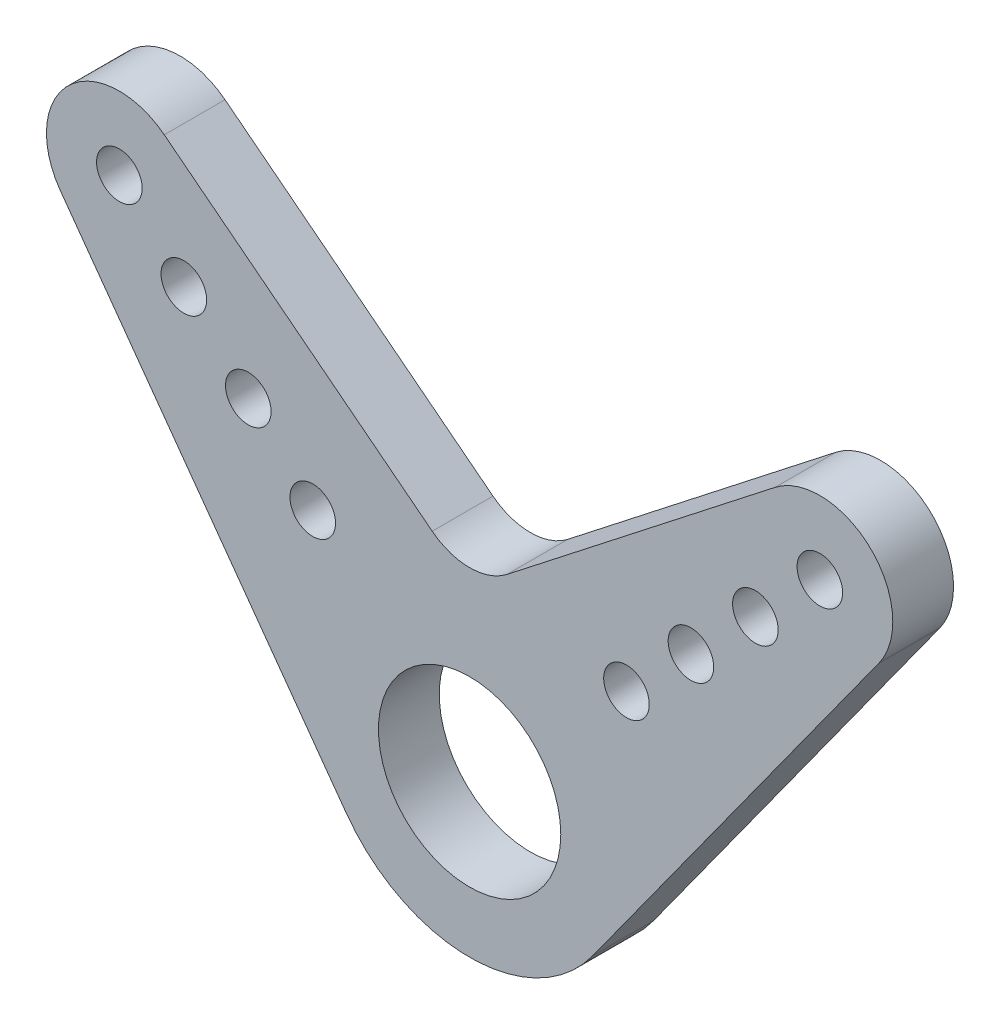
ISO-10303-21;
HEADER;
FILE_DESCRIPTION(('STEP AP214'),'2;1');
FILE_NAME('part.step','',(''),(''),'','','');
FILE_SCHEMA(('AUTOMOTIVE_DESIGN { 1 0 10303 214 1 1 1 1 }'));
ENDSEC;
DATA;
#1=APPLICATION_CONTEXT('core data for automotive mechanical design processes');
#2=APPLICATION_PROTOCOL_DEFINITION('international standard','automotive_design',2000,#1);
#3=PRODUCT_CONTEXT('',#1,'mechanical');
#4=PRODUCT('Part','Part','',(#3));
#5=PRODUCT_RELATED_PRODUCT_CATEGORY('part','',(#4));
#6=PRODUCT_DEFINITION_FORMATION('','',#4);
#7=PRODUCT_DEFINITION_CONTEXT('part definition',#1,'design');
#8=PRODUCT_DEFINITION('design','',#6,#7);
#9=PRODUCT_DEFINITION_SHAPE('','',#8);
#10=(LENGTH_UNIT() NAMED_UNIT(*) SI_UNIT(.MILLI.,.METRE.));
#11=(NAMED_UNIT(*) PLANE_ANGLE_UNIT() SI_UNIT($,.RADIAN.));
#12=(NAMED_UNIT(*) SI_UNIT($,.STERADIAN.) SOLID_ANGLE_UNIT());
#13=UNCERTAINTY_MEASURE_WITH_UNIT(LENGTH_MEASURE(1.E-05),#10,'distance_accuracy_value','');
#14=(GEOMETRIC_REPRESENTATION_CONTEXT(3) GLOBAL_UNCERTAINTY_ASSIGNED_CONTEXT((#13)) GLOBAL_UNIT_ASSIGNED_CONTEXT((#10,
#11,#12)) REPRESENTATION_CONTEXT('',''));
#15=CARTESIAN_POINT('',(0.,0.,0.));
#16=DIRECTION('',(0.,0.,1.));
#17=DIRECTION('',(1.,0.,0.));
#18=AXIS2_PLACEMENT_3D('',#15,#16,#17);
#19=CARTESIAN_POINT('',(0.,0.,2.));
#20=DIRECTION('',(0.,0.,1.));
#21=DIRECTION('',(1.,0.,0.));
#22=AXIS2_PLACEMENT_3D('',#19,#20,#21);
#23=PLANE('',#22);
#24=CARTESIAN_POINT('',(-11.5258405333407,11.5258405333408,2.));
#25=DIRECTION('',(0.,0.,1.));
#26=DIRECTION('',(-1.,0.,0.));
#27=AXIS2_PLACEMENT_3D('',#24,#25,#26);
#28=CIRCLE('',#27,0.75);
#29=CARTESIAN_POINT('',(-12.2758405333407,11.5258405333408,2.));
#30=VERTEX_POINT('',#29);
#31=EDGE_CURVE('E224',#30,#30,#28,.T.);
#32=ORIENTED_EDGE('',*,*,#31,.F.);
#33=EDGE_LOOP('',(#32));
#34=FACE_BOUND('',#33,.T.);
#35=CARTESIAN_POINT('',(-9.40452018978103,9.40452018978114,2.));
#36=DIRECTION('',(0.,0.,1.));
#37=DIRECTION('',(-1.,0.,0.));
#38=AXIS2_PLACEMENT_3D('',#35,#36,#37);
#39=CIRCLE('',#38,0.749999999999999);
#40=CARTESIAN_POINT('',(-10.154520189781,9.40452018978114,2.));
#41=VERTEX_POINT('',#40);
#42=EDGE_CURVE('E218',#41,#41,#39,.T.);
#43=ORIENTED_EDGE('',*,*,#42,.F.);
#44=EDGE_LOOP('',(#43));
#45=FACE_BOUND('',#44,.T.);
#46=CARTESIAN_POINT('',(-7.2831998462214,7.28319984622148,2.));
#47=DIRECTION('',(0.,0.,1.));
#48=DIRECTION('',(-1.,0.,0.));
#49=AXIS2_PLACEMENT_3D('',#46,#47,#48);
#50=CIRCLE('',#49,0.749999999999998);
#51=CARTESIAN_POINT('',(-8.0331998462214,7.28319984622148,2.));
#52=VERTEX_POINT('',#51);
#53=EDGE_CURVE('E212',#52,#52,#50,.T.);
#54=ORIENTED_EDGE('',*,*,#53,.F.);
#55=EDGE_LOOP('',(#54));
#56=FACE_BOUND('',#55,.T.);
#57=CARTESIAN_POINT('',(-5.16187950266177,5.16187950266183,2.));
#58=DIRECTION('',(0.,0.,1.));
#59=DIRECTION('',(-1.,0.,0.));
#60=AXIS2_PLACEMENT_3D('',#57,#58,#59);
#61=CIRCLE('',#60,0.749999999999999);
#62=CARTESIAN_POINT('',(-5.91187950266177,5.16187950266183,2.));
#63=VERTEX_POINT('',#62);
#64=EDGE_CURVE('E206',#63,#63,#61,.T.);
#65=ORIENTED_EDGE('',*,*,#64,.F.);
#66=EDGE_LOOP('',(#65));
#67=FACE_BOUND('',#66,.T.);
#68=CARTESIAN_POINT('',(5.16187950266177,5.16187950266183,2.));
#69=DIRECTION('',(0.,0.,1.));
#70=DIRECTION('',(1.,0.,0.));
#71=AXIS2_PLACEMENT_3D('',#68,#69,#70);
#72=CIRCLE('',#71,0.749999999999998);
#73=CARTESIAN_POINT('',(5.91187950266177,5.16187950266183,2.));
#74=VERTEX_POINT('',#73);
#75=EDGE_CURVE('E200',#74,#74,#72,.T.);
#76=ORIENTED_EDGE('',*,*,#75,.F.);
#77=EDGE_LOOP('',(#76));
#78=FACE_BOUND('',#77,.T.);
#79=CARTESIAN_POINT('',(7.2831998462214,7.28319984622148,2.));
#80=DIRECTION('',(0.,0.,1.));
#81=DIRECTION('',(1.,0.,0.));
#82=AXIS2_PLACEMENT_3D('',#79,#80,#81);
#83=CIRCLE('',#82,0.749999999999997);
#84=CARTESIAN_POINT('',(8.0331998462214,7.28319984622148,2.));
#85=VERTEX_POINT('',#84);
#86=EDGE_CURVE('E194',#85,#85,#83,.T.);
#87=ORIENTED_EDGE('',*,*,#86,.F.);
#88=EDGE_LOOP('',(#87));
#89=FACE_BOUND('',#88,.T.);
#90=CARTESIAN_POINT('',(9.40452018978103,9.40452018978114,2.));
#91=DIRECTION('',(0.,0.,1.));
#92=DIRECTION('',(1.,0.,0.));
#93=AXIS2_PLACEMENT_3D('',#90,#91,#92);
#94=CIRCLE('',#93,0.749999999999999);
#95=CARTESIAN_POINT('',(10.154520189781,9.40452018978114,2.));
#96=VERTEX_POINT('',#95);
#97=EDGE_CURVE('E188',#96,#96,#94,.T.);
#98=ORIENTED_EDGE('',*,*,#97,.F.);
#99=EDGE_LOOP('',(#98));
#100=FACE_BOUND('',#99,.T.);
#101=CARTESIAN_POINT('',(11.5258405333407,11.5258405333408,2.));
#102=DIRECTION('',(0.,0.,1.));
#103=DIRECTION('',(1.,0.,0.));
#104=AXIS2_PLACEMENT_3D('',#101,#102,#103);
#105=CIRCLE('',#104,0.75);
#106=CARTESIAN_POINT('',(12.2758405333407,11.5258405333408,2.));
#107=VERTEX_POINT('',#106);
#108=EDGE_CURVE('E182',#107,#107,#105,.T.);
#109=ORIENTED_EDGE('',*,*,#108,.F.);
#110=EDGE_LOOP('',(#109));
#111=FACE_BOUND('',#110,.T.);
#112=CARTESIAN_POINT('',(0.,0.,2.));
#113=DIRECTION('',(0.,0.,1.));
#114=DIRECTION('',(1.,0.,0.));
#115=AXIS2_PLACEMENT_3D('',#112,#113,#114);
#116=CIRCLE('',#115,5.);
#117=CARTESIAN_POINT('',(-4.05421668472172,-2.92631629755295,2.));
#118=VERTEX_POINT('',#117);
#119=CARTESIAN_POINT('',(4.05421668472172,-2.92631629755295,2.));
#120=VERTEX_POINT('',#119);
#121=EDGE_CURVE('E142',#118,#120,#116,.T.);
#122=ORIENTED_EDGE('',*,*,#121,.T.);
#123=DIRECTION('',(0.585263259510591,0.810843336944344,0.));
#124=VECTOR('',#123,1.);
#125=CARTESIAN_POINT('',(13.4718645420071,10.1212087105154,2.));
#126=LINE('',#125,#124);
#127=CARTESIAN_POINT('',(13.4718645420071,10.1212087105154,2.));
#128=VERTEX_POINT('',#127);
#129=EDGE_CURVE('E90',#120,#128,#126,.T.);
#130=ORIENTED_EDGE('',*,*,#129,.T.);
#131=CARTESIAN_POINT('',(11.5258405333407,11.5258405333408,2.));
#132=DIRECTION('',(0.,0.,1.));
#133=DIRECTION('',(1.,0.,0.));
#134=AXIS2_PLACEMENT_3D('',#131,#132,#133);
#135=CIRCLE('',#134,2.4);
#136=CARTESIAN_POINT('',(10.0482529925591,13.4170663419969,2.));
#137=VERTEX_POINT('',#136);
#138=EDGE_CURVE('E157',#128,#137,#135,.T.);
#139=ORIENTED_EDGE('',*,*,#138,.T.);
#140=DIRECTION('',(-0.788010753606714,-0.615661475325668,0.));
#141=VECTOR('',#140,1.);
#142=CARTESIAN_POINT('',(10.0482529925591,13.4170663419969,2.));
#143=LINE('',#142,#141);
#144=CARTESIAN_POINT('',(1.23132295065134,6.52852563033896,2.));
#145=VERTEX_POINT('',#144);
#146=EDGE_CURVE('E170',#137,#145,#143,.T.);
#147=ORIENTED_EDGE('',*,*,#146,.T.);
#148=CARTESIAN_POINT('',(0.,8.10454713755239,2.));
#149=DIRECTION('',(0.,0.,-1.));
#150=DIRECTION('',(-1.,0.,0.));
#151=AXIS2_PLACEMENT_3D('',#148,#149,#150);
#152=CIRCLE('',#151,2.);
#153=CARTESIAN_POINT('',(-1.23132295065134,6.52852563033896,2.));
#154=VERTEX_POINT('',#153);
#155=EDGE_CURVE('E109',#145,#154,#152,.T.);
#156=ORIENTED_EDGE('',*,*,#155,.T.);
#157=DIRECTION('',(-0.788010753606714,0.615661475325668,0.));
#158=VECTOR('',#157,1.);
#159=CARTESIAN_POINT('',(-10.0482529925591,13.4170663419969,2.));
#160=LINE('',#159,#158);
#161=CARTESIAN_POINT('',(-10.0482529925591,13.4170663419969,2.));
#162=VERTEX_POINT('',#161);
#163=EDGE_CURVE('E103',#154,#162,#160,.T.);
#164=ORIENTED_EDGE('',*,*,#163,.T.);
#165=CARTESIAN_POINT('',(-11.5258405333407,11.5258405333408,2.));
#166=DIRECTION('',(0.,0.,1.));
#167=DIRECTION('',(-1.,0.,0.));
#168=AXIS2_PLACEMENT_3D('',#165,#166,#167);
#169=CIRCLE('',#168,2.4);
#170=CARTESIAN_POINT('',(-13.4718645420071,10.1212087105154,2.));
#171=VERTEX_POINT('',#170);
#172=EDGE_CURVE('E107',#162,#171,#169,.T.);
#173=ORIENTED_EDGE('',*,*,#172,.T.);
#174=DIRECTION('',(0.585263259510591,-0.810843336944344,0.));
#175=VECTOR('',#174,1.);
#176=CARTESIAN_POINT('',(-13.4718645420071,10.1212087105154,2.));
#177=LINE('',#176,#175);
#178=EDGE_CURVE('E47',#171,#118,#177,.T.);
#179=ORIENTED_EDGE('',*,*,#178,.T.);
#180=EDGE_LOOP('',(#122,#130,#139,#147,#156,#164,#173,#179));
#181=FACE_BOUND('',#180,.T.);
#182=CARTESIAN_POINT('',(0.,0.,2.));
#183=DIRECTION('',(0.,0.,1.));
#184=DIRECTION('',(1.,0.,0.));
#185=AXIS2_PLACEMENT_3D('',#182,#183,#184);
#186=CIRCLE('',#185,3.);
#187=CARTESIAN_POINT('',(3.,0.,2.));
#188=VERTEX_POINT('',#187);
#189=EDGE_CURVE('E131',#188,#188,#186,.T.);
#190=ORIENTED_EDGE('',*,*,#189,.F.);
#191=EDGE_LOOP('',(#190));
#192=FACE_BOUND('',#191,.T.);
#193=ADVANCED_FACE('F30',(#34,#45,#56,#67,#78,#89,#100,#111,#181,#192),#23,.T.);
#194=CARTESIAN_POINT('',(0.,0.,0.));
#195=DIRECTION('',(0.,0.,1.));
#196=DIRECTION('',(1.,0.,0.));
#197=AXIS2_PLACEMENT_3D('',#194,#195,#196);
#198=PLANE('',#197);
#199=CARTESIAN_POINT('',(-11.5258405333407,11.5258405333408,0.));
#200=DIRECTION('',(0.,0.,1.));
#201=DIRECTION('',(-1.,0.,0.));
#202=AXIS2_PLACEMENT_3D('',#199,#200,#201);
#203=CIRCLE('',#202,0.75);
#204=CARTESIAN_POINT('',(-12.2758405333407,11.5258405333408,0.));
#205=VERTEX_POINT('',#204);
#206=EDGE_CURVE('E221',#205,#205,#203,.T.);
#207=ORIENTED_EDGE('',*,*,#206,.T.);
#208=EDGE_LOOP('',(#207));
#209=FACE_BOUND('',#208,.T.);
#210=CARTESIAN_POINT('',(-9.40452018978103,9.40452018978114,0.));
#211=DIRECTION('',(0.,0.,1.));
#212=DIRECTION('',(-1.,0.,0.));
#213=AXIS2_PLACEMENT_3D('',#210,#211,#212);
#214=CIRCLE('',#213,0.749999999999999);
#215=CARTESIAN_POINT('',(-10.154520189781,9.40452018978114,0.));
#216=VERTEX_POINT('',#215);
#217=EDGE_CURVE('E215',#216,#216,#214,.T.);
#218=ORIENTED_EDGE('',*,*,#217,.T.);
#219=EDGE_LOOP('',(#218));
#220=FACE_BOUND('',#219,.T.);
#221=CARTESIAN_POINT('',(-7.2831998462214,7.28319984622148,0.));
#222=DIRECTION('',(0.,0.,1.));
#223=DIRECTION('',(-1.,0.,0.));
#224=AXIS2_PLACEMENT_3D('',#221,#222,#223);
#225=CIRCLE('',#224,0.749999999999998);
#226=CARTESIAN_POINT('',(-8.0331998462214,7.28319984622148,0.));
#227=VERTEX_POINT('',#226);
#228=EDGE_CURVE('E209',#227,#227,#225,.T.);
#229=ORIENTED_EDGE('',*,*,#228,.T.);
#230=EDGE_LOOP('',(#229));
#231=FACE_BOUND('',#230,.T.);
#232=CARTESIAN_POINT('',(-5.16187950266177,5.16187950266183,0.));
#233=DIRECTION('',(0.,0.,1.));
#234=DIRECTION('',(-1.,0.,0.));
#235=AXIS2_PLACEMENT_3D('',#232,#233,#234);
#236=CIRCLE('',#235,0.749999999999999);
#237=CARTESIAN_POINT('',(-5.91187950266177,5.16187950266183,0.));
#238=VERTEX_POINT('',#237);
#239=EDGE_CURVE('E203',#238,#238,#236,.T.);
#240=ORIENTED_EDGE('',*,*,#239,.T.);
#241=EDGE_LOOP('',(#240));
#242=FACE_BOUND('',#241,.T.);
#243=CARTESIAN_POINT('',(5.16187950266177,5.16187950266183,0.));
#244=DIRECTION('',(0.,0.,1.));
#245=DIRECTION('',(1.,0.,0.));
#246=AXIS2_PLACEMENT_3D('',#243,#244,#245);
#247=CIRCLE('',#246,0.749999999999998);
#248=CARTESIAN_POINT('',(5.91187950266177,5.16187950266183,0.));
#249=VERTEX_POINT('',#248);
#250=EDGE_CURVE('E197',#249,#249,#247,.T.);
#251=ORIENTED_EDGE('',*,*,#250,.T.);
#252=EDGE_LOOP('',(#251));
#253=FACE_BOUND('',#252,.T.);
#254=CARTESIAN_POINT('',(7.2831998462214,7.28319984622148,0.));
#255=DIRECTION('',(0.,0.,1.));
#256=DIRECTION('',(1.,0.,0.));
#257=AXIS2_PLACEMENT_3D('',#254,#255,#256);
#258=CIRCLE('',#257,0.749999999999997);
#259=CARTESIAN_POINT('',(8.0331998462214,7.28319984622148,0.));
#260=VERTEX_POINT('',#259);
#261=EDGE_CURVE('E191',#260,#260,#258,.T.);
#262=ORIENTED_EDGE('',*,*,#261,.T.);
#263=EDGE_LOOP('',(#262));
#264=FACE_BOUND('',#263,.T.);
#265=CARTESIAN_POINT('',(9.40452018978103,9.40452018978114,0.));
#266=DIRECTION('',(0.,0.,1.));
#267=DIRECTION('',(1.,0.,0.));
#268=AXIS2_PLACEMENT_3D('',#265,#266,#267);
#269=CIRCLE('',#268,0.749999999999999);
#270=CARTESIAN_POINT('',(10.154520189781,9.40452018978114,0.));
#271=VERTEX_POINT('',#270);
#272=EDGE_CURVE('E185',#271,#271,#269,.T.);
#273=ORIENTED_EDGE('',*,*,#272,.T.);
#274=EDGE_LOOP('',(#273));
#275=FACE_BOUND('',#274,.T.);
#276=CARTESIAN_POINT('',(11.5258405333407,11.5258405333408,0.));
#277=DIRECTION('',(0.,0.,1.));
#278=DIRECTION('',(1.,0.,0.));
#279=AXIS2_PLACEMENT_3D('',#276,#277,#278);
#280=CIRCLE('',#279,0.75);
#281=CARTESIAN_POINT('',(12.2758405333407,11.5258405333408,0.));
#282=VERTEX_POINT('',#281);
#283=EDGE_CURVE('E179',#282,#282,#280,.T.);
#284=ORIENTED_EDGE('',*,*,#283,.T.);
#285=EDGE_LOOP('',(#284));
#286=FACE_BOUND('',#285,.T.);
#287=CARTESIAN_POINT('',(0.,0.,0.));
#288=DIRECTION('',(0.,0.,1.));
#289=DIRECTION('',(1.,0.,0.));
#290=AXIS2_PLACEMENT_3D('',#287,#288,#289);
#291=CIRCLE('',#290,5.);
#292=CARTESIAN_POINT('',(-4.05421668472172,-2.92631629755295,0.));
#293=VERTEX_POINT('',#292);
#294=CARTESIAN_POINT('',(4.05421668472172,-2.92631629755295,0.));
#295=VERTEX_POINT('',#294);
#296=EDGE_CURVE('E127',#293,#295,#291,.T.);
#297=ORIENTED_EDGE('',*,*,#296,.F.);
#298=DIRECTION('',(0.585263259510591,-0.810843336944344,0.));
#299=VECTOR('',#298,1.);
#300=CARTESIAN_POINT('',(-13.4718645420071,10.1212087105154,0.));
#301=LINE('',#300,#299);
#302=CARTESIAN_POINT('',(-13.4718645420071,10.1212087105154,0.));
#303=VERTEX_POINT('',#302);
#304=EDGE_CURVE('E82',#303,#293,#301,.T.);
#305=ORIENTED_EDGE('',*,*,#304,.F.);
#306=CARTESIAN_POINT('',(-11.5258405333407,11.5258405333408,0.));
#307=DIRECTION('',(0.,0.,1.));
#308=DIRECTION('',(-1.,0.,0.));
#309=AXIS2_PLACEMENT_3D('',#306,#307,#308);
#310=CIRCLE('',#309,2.4);
#311=CARTESIAN_POINT('',(-10.0482529925591,13.4170663419969,0.));
#312=VERTEX_POINT('',#311);
#313=EDGE_CURVE('E76',#312,#303,#310,.T.);
#314=ORIENTED_EDGE('',*,*,#313,.F.);
#315=DIRECTION('',(-0.788010753606714,0.615661475325668,0.));
#316=VECTOR('',#315,1.);
#317=CARTESIAN_POINT('',(-10.0482529925591,13.4170663419969,0.));
#318=LINE('',#317,#316);
#319=CARTESIAN_POINT('',(-1.23132295065134,6.52852563033896,0.));
#320=VERTEX_POINT('',#319);
#321=EDGE_CURVE('E117',#320,#312,#318,.T.);
#322=ORIENTED_EDGE('',*,*,#321,.F.);
#323=CARTESIAN_POINT('',(0.,8.10454713755239,0.));
#324=DIRECTION('',(0.,0.,-1.));
#325=DIRECTION('',(-1.,0.,0.));
#326=AXIS2_PLACEMENT_3D('',#323,#324,#325);
#327=CIRCLE('',#326,2.);
#328=CARTESIAN_POINT('',(1.23132295065134,6.52852563033896,0.));
#329=VERTEX_POINT('',#328);
#330=EDGE_CURVE('E137',#329,#320,#327,.T.);
#331=ORIENTED_EDGE('',*,*,#330,.F.);
#332=DIRECTION('',(-0.788010753606714,-0.615661475325668,0.));
#333=VECTOR('',#332,1.);
#334=CARTESIAN_POINT('',(10.0482529925591,13.4170663419969,0.));
#335=LINE('',#334,#333);
#336=CARTESIAN_POINT('',(10.0482529925591,13.4170663419969,0.));
#337=VERTEX_POINT('',#336);
#338=EDGE_CURVE('E135',#337,#329,#335,.T.);
#339=ORIENTED_EDGE('',*,*,#338,.F.);
#340=CARTESIAN_POINT('',(11.5258405333407,11.5258405333408,0.));
#341=DIRECTION('',(0.,0.,1.));
#342=DIRECTION('',(1.,0.,0.));
#343=AXIS2_PLACEMENT_3D('',#340,#341,#342);
#344=CIRCLE('',#343,2.4);
#345=CARTESIAN_POINT('',(13.4718645420071,10.1212087105154,0.));
#346=VERTEX_POINT('',#345);
#347=EDGE_CURVE('E133',#346,#337,#344,.T.);
#348=ORIENTED_EDGE('',*,*,#347,.F.);
#349=DIRECTION('',(0.585263259510591,0.810843336944344,0.));
#350=VECTOR('',#349,1.);
#351=CARTESIAN_POINT('',(13.4718645420071,10.1212087105154,0.));
#352=LINE('',#351,#350);
#353=EDGE_CURVE('E130',#295,#346,#352,.T.);
#354=ORIENTED_EDGE('',*,*,#353,.F.);
#355=EDGE_LOOP('',(#297,#305,#314,#322,#331,#339,#348,#354));
#356=FACE_BOUND('',#355,.T.);
#357=CARTESIAN_POINT('',(0.,0.,0.));
#358=DIRECTION('',(0.,0.,1.));
#359=DIRECTION('',(1.,0.,0.));
#360=AXIS2_PLACEMENT_3D('',#357,#358,#359);
#361=CIRCLE('',#360,3.);
#362=CARTESIAN_POINT('',(3.,0.,0.));
#363=VERTEX_POINT('',#362);
#364=EDGE_CURVE('E176',#363,#363,#361,.T.);
#365=ORIENTED_EDGE('',*,*,#364,.T.);
#366=EDGE_LOOP('',(#365));
#367=FACE_BOUND('',#366,.T.);
#368=ADVANCED_FACE('F161',(#209,#220,#231,#242,#253,#264,#275,#286,#356,#367),#198,.F.);
#369=CARTESIAN_POINT('',(0.,0.,2.));
#370=DIRECTION('',(0.,0.,-1.));
#371=DIRECTION('',(-1.,0.,0.));
#372=AXIS2_PLACEMENT_3D('',#369,#370,#371);
#373=CYLINDRICAL_SURFACE('',#372,5.);
#374=ORIENTED_EDGE('',*,*,#296,.T.);
#375=DIRECTION('',(0.,0.,-1.));
#376=VECTOR('',#375,1.);
#377=CARTESIAN_POINT('',(4.05421668472172,-2.92631629755295,2.));
#378=LINE('',#377,#376);
#379=EDGE_CURVE('E11',#120,#295,#378,.T.);
#380=ORIENTED_EDGE('',*,*,#379,.F.);
#381=ORIENTED_EDGE('',*,*,#121,.F.);
#382=DIRECTION('',(0.,0.,-1.));
#383=VECTOR('',#382,1.);
#384=CARTESIAN_POINT('',(-4.05421668472172,-2.92631629755295,2.));
#385=LINE('',#384,#383);
#386=EDGE_CURVE('E123',#118,#293,#385,.T.);
#387=ORIENTED_EDGE('',*,*,#386,.T.);
#388=EDGE_LOOP('',(#374,#380,#381,#387));
#389=FACE_BOUND('',#388,.T.);
#390=ADVANCED_FACE('F32',(#389),#373,.T.);
#391=CARTESIAN_POINT('',(13.4718645420071,10.1212087105154,2.));
#392=DIRECTION('',(-0.810843336944344,0.585263259510591,0.));
#393=DIRECTION('',(-0.585263259510591,-0.810843336944344,0.));
#394=AXIS2_PLACEMENT_3D('',#391,#392,#393);
#395=PLANE('',#394);
#396=ORIENTED_EDGE('',*,*,#353,.T.);
#397=DIRECTION('',(0.,0.,-1.));
#398=VECTOR('',#397,1.);
#399=CARTESIAN_POINT('',(13.4718645420071,10.1212087105154,2.));
#400=LINE('',#399,#398);
#401=EDGE_CURVE('E39',#128,#346,#400,.T.);
#402=ORIENTED_EDGE('',*,*,#401,.F.);
#403=ORIENTED_EDGE('',*,*,#129,.F.);
#404=ORIENTED_EDGE('',*,*,#379,.T.);
#405=EDGE_LOOP('',(#396,#402,#403,#404));
#406=FACE_BOUND('',#405,.T.);
#407=ADVANCED_FACE('F288',(#406),#395,.F.);
#408=CARTESIAN_POINT('',(11.5258405333407,11.5258405333408,2.));
#409=DIRECTION('',(0.,0.,-1.));
#410=DIRECTION('',(-1.,0.,0.));
#411=AXIS2_PLACEMENT_3D('',#408,#409,#410);
#412=CYLINDRICAL_SURFACE('',#411,2.4);
#413=ORIENTED_EDGE('',*,*,#347,.T.);
#414=DIRECTION('',(0.,0.,-1.));
#415=VECTOR('',#414,1.);
#416=CARTESIAN_POINT('',(10.0482529925591,13.4170663419969,2.));
#417=LINE('',#416,#415);
#418=EDGE_CURVE('E149',#137,#337,#417,.T.);
#419=ORIENTED_EDGE('',*,*,#418,.F.);
#420=ORIENTED_EDGE('',*,*,#138,.F.);
#421=ORIENTED_EDGE('',*,*,#401,.T.);
#422=EDGE_LOOP('',(#413,#419,#420,#421));
#423=FACE_BOUND('',#422,.T.);
#424=ADVANCED_FACE('F155',(#423),#412,.T.);
#425=CARTESIAN_POINT('',(10.0482529925591,13.4170663419969,2.));
#426=DIRECTION('',(0.615661475325668,-0.788010753606714,0.));
#427=DIRECTION('',(0.788010753606714,0.615661475325668,0.));
#428=AXIS2_PLACEMENT_3D('',#425,#426,#427);
#429=PLANE('',#428);
#430=ORIENTED_EDGE('',*,*,#338,.T.);
#431=DIRECTION('',(0.,0.,-1.));
#432=VECTOR('',#431,1.);
#433=CARTESIAN_POINT('',(1.23132295065134,6.52852563033896,2.));
#434=LINE('',#433,#432);
#435=EDGE_CURVE('E146',#145,#329,#434,.T.);
#436=ORIENTED_EDGE('',*,*,#435,.F.);
#437=ORIENTED_EDGE('',*,*,#146,.F.);
#438=ORIENTED_EDGE('',*,*,#418,.T.);
#439=EDGE_LOOP('',(#430,#436,#437,#438));
#440=FACE_BOUND('',#439,.T.);
#441=ADVANCED_FACE('F166',(#440),#429,.F.);
#442=CARTESIAN_POINT('',(0.,8.10454713755239,2.));
#443=DIRECTION('',(0.,0.,-1.));
#444=DIRECTION('',(-1.,0.,0.));
#445=AXIS2_PLACEMENT_3D('',#442,#443,#444);
#446=CYLINDRICAL_SURFACE('',#445,2.);
#447=ORIENTED_EDGE('',*,*,#330,.T.);
#448=DIRECTION('',(0.,0.,-1.));
#449=VECTOR('',#448,1.);
#450=CARTESIAN_POINT('',(-1.23132295065134,6.52852563033896,2.));
#451=LINE('',#450,#449);
#452=EDGE_CURVE('E118',#154,#320,#451,.T.);
#453=ORIENTED_EDGE('',*,*,#452,.F.);
#454=ORIENTED_EDGE('',*,*,#155,.F.);
#455=ORIENTED_EDGE('',*,*,#435,.T.);
#456=EDGE_LOOP('',(#447,#453,#454,#455));
#457=FACE_BOUND('',#456,.T.);
#458=ADVANCED_FACE('F169',(#457),#446,.F.);
#459=CARTESIAN_POINT('',(-10.0482529925591,13.4170663419969,2.));
#460=DIRECTION('',(-0.615661475325668,-0.788010753606714,0.));
#461=DIRECTION('',(0.788010753606714,-0.615661475325668,0.));
#462=AXIS2_PLACEMENT_3D('',#459,#460,#461);
#463=PLANE('',#462);
#464=ORIENTED_EDGE('',*,*,#321,.T.);
#465=DIRECTION('',(0.,0.,-1.));
#466=VECTOR('',#465,1.);
#467=CARTESIAN_POINT('',(-10.0482529925591,13.4170663419969,2.));
#468=LINE('',#467,#466);
#469=EDGE_CURVE('E114',#162,#312,#468,.T.);
#470=ORIENTED_EDGE('',*,*,#469,.F.);
#471=ORIENTED_EDGE('',*,*,#163,.F.);
#472=ORIENTED_EDGE('',*,*,#452,.T.);
#473=EDGE_LOOP('',(#464,#470,#471,#472));
#474=FACE_BOUND('',#473,.T.);
#475=ADVANCED_FACE('F115',(#474),#463,.F.);
#476=CARTESIAN_POINT('',(-11.5258405333407,11.5258405333408,2.));
#477=DIRECTION('',(0.,0.,-1.));
#478=DIRECTION('',(-1.,0.,0.));
#479=AXIS2_PLACEMENT_3D('',#476,#477,#478);
#480=CYLINDRICAL_SURFACE('',#479,2.4);
#481=ORIENTED_EDGE('',*,*,#313,.T.);
#482=DIRECTION('',(0.,0.,-1.));
#483=VECTOR('',#482,1.);
#484=CARTESIAN_POINT('',(-13.4718645420071,10.1212087105154,2.));
#485=LINE('',#484,#483);
#486=EDGE_CURVE('E119',#171,#303,#485,.T.);
#487=ORIENTED_EDGE('',*,*,#486,.F.);
#488=ORIENTED_EDGE('',*,*,#172,.F.);
#489=ORIENTED_EDGE('',*,*,#469,.T.);
#490=EDGE_LOOP('',(#481,#487,#488,#489));
#491=FACE_BOUND('',#490,.T.);
#492=ADVANCED_FACE('F121',(#491),#480,.T.);
#493=CARTESIAN_POINT('',(-13.4718645420071,10.1212087105154,2.));
#494=DIRECTION('',(0.810843336944344,0.585263259510591,0.));
#495=DIRECTION('',(-0.585263259510591,0.810843336944344,0.));
#496=AXIS2_PLACEMENT_3D('',#493,#494,#495);
#497=PLANE('',#496);
#498=ORIENTED_EDGE('',*,*,#304,.T.);
#499=ORIENTED_EDGE('',*,*,#386,.F.);
#500=ORIENTED_EDGE('',*,*,#178,.F.);
#501=ORIENTED_EDGE('',*,*,#486,.T.);
#502=EDGE_LOOP('',(#498,#499,#500,#501));
#503=FACE_BOUND('',#502,.T.);
#504=ADVANCED_FACE('F269',(#503),#497,.F.);
#505=CARTESIAN_POINT('',(0.,0.,2.));
#506=DIRECTION('',(0.,0.,-1.));
#507=DIRECTION('',(-1.,0.,0.));
#508=AXIS2_PLACEMENT_3D('',#505,#506,#507);
#509=CYLINDRICAL_SURFACE('',#508,3.);
#510=ORIENTED_EDGE('',*,*,#189,.T.);
#511=EDGE_LOOP('',(#510));
#512=FACE_BOUND('',#511,.T.);
#513=ORIENTED_EDGE('',*,*,#364,.F.);
#514=EDGE_LOOP('',(#513));
#515=FACE_BOUND('',#514,.T.);
#516=ADVANCED_FACE('F259',(#512,#515),#509,.F.);
#517=CARTESIAN_POINT('',(11.5258405333407,11.5258405333408,0.));
#518=DIRECTION('',(0.,0.,1.));
#519=DIRECTION('',(1.,0.,0.));
#520=AXIS2_PLACEMENT_3D('',#517,#518,#519);
#521=CYLINDRICAL_SURFACE('',#520,0.75);
#522=ORIENTED_EDGE('',*,*,#283,.F.);
#523=EDGE_LOOP('',(#522));
#524=FACE_BOUND('',#523,.T.);
#525=ORIENTED_EDGE('',*,*,#108,.T.);
#526=EDGE_LOOP('',(#525));
#527=FACE_BOUND('',#526,.T.);
#528=ADVANCED_FACE('F256',(#524,#527),#521,.F.);
#529=CARTESIAN_POINT('',(9.40452018978103,9.40452018978114,0.));
#530=DIRECTION('',(0.,0.,1.));
#531=DIRECTION('',(1.,0.,0.));
#532=AXIS2_PLACEMENT_3D('',#529,#530,#531);
#533=CYLINDRICAL_SURFACE('',#532,0.749999999999999);
#534=ORIENTED_EDGE('',*,*,#272,.F.);
#535=EDGE_LOOP('',(#534));
#536=FACE_BOUND('',#535,.T.);
#537=ORIENTED_EDGE('',*,*,#97,.T.);
#538=EDGE_LOOP('',(#537));
#539=FACE_BOUND('',#538,.T.);
#540=ADVANCED_FACE('F258',(#536,#539),#533,.F.);
#541=CARTESIAN_POINT('',(7.2831998462214,7.28319984622148,0.));
#542=DIRECTION('',(0.,0.,1.));
#543=DIRECTION('',(1.,0.,0.));
#544=AXIS2_PLACEMENT_3D('',#541,#542,#543);
#545=CYLINDRICAL_SURFACE('',#544,0.749999999999997);
#546=ORIENTED_EDGE('',*,*,#261,.F.);
#547=EDGE_LOOP('',(#546));
#548=FACE_BOUND('',#547,.T.);
#549=ORIENTED_EDGE('',*,*,#86,.T.);
#550=EDGE_LOOP('',(#549));
#551=FACE_BOUND('',#550,.T.);
#552=ADVANCED_FACE('F266',(#548,#551),#545,.F.);
#553=CARTESIAN_POINT('',(5.16187950266177,5.16187950266183,0.));
#554=DIRECTION('',(0.,0.,1.));
#555=DIRECTION('',(1.,0.,0.));
#556=AXIS2_PLACEMENT_3D('',#553,#554,#555);
#557=CYLINDRICAL_SURFACE('',#556,0.749999999999998);
#558=ORIENTED_EDGE('',*,*,#250,.F.);
#559=EDGE_LOOP('',(#558));
#560=FACE_BOUND('',#559,.T.);
#561=ORIENTED_EDGE('',*,*,#75,.T.);
#562=EDGE_LOOP('',(#561));
#563=FACE_BOUND('',#562,.T.);
#564=ADVANCED_FACE('F375',(#560,#563),#557,.F.);
#565=CARTESIAN_POINT('',(-5.16187950266177,5.16187950266183,0.));
#566=DIRECTION('',(0.,0.,1.));
#567=DIRECTION('',(1.,0.,0.));
#568=AXIS2_PLACEMENT_3D('',#565,#566,#567);
#569=CYLINDRICAL_SURFACE('',#568,0.749999999999999);
#570=ORIENTED_EDGE('',*,*,#239,.F.);
#571=EDGE_LOOP('',(#570));
#572=FACE_BOUND('',#571,.T.);
#573=ORIENTED_EDGE('',*,*,#64,.T.);
#574=EDGE_LOOP('',(#573));
#575=FACE_BOUND('',#574,.T.);
#576=ADVANCED_FACE('F383',(#572,#575),#569,.F.);
#577=CARTESIAN_POINT('',(-7.2831998462214,7.28319984622148,0.));
#578=DIRECTION('',(0.,0.,1.));
#579=DIRECTION('',(1.,0.,0.));
#580=AXIS2_PLACEMENT_3D('',#577,#578,#579);
#581=CYLINDRICAL_SURFACE('',#580,0.749999999999998);
#582=ORIENTED_EDGE('',*,*,#228,.F.);
#583=EDGE_LOOP('',(#582));
#584=FACE_BOUND('',#583,.T.);
#585=ORIENTED_EDGE('',*,*,#53,.T.);
#586=EDGE_LOOP('',(#585));
#587=FACE_BOUND('',#586,.T.);
#588=ADVANCED_FACE('F392',(#584,#587),#581,.F.);
#589=CARTESIAN_POINT('',(-9.40452018978103,9.40452018978114,0.));
#590=DIRECTION('',(0.,0.,1.));
#591=DIRECTION('',(1.,0.,0.));
#592=AXIS2_PLACEMENT_3D('',#589,#590,#591);
#593=CYLINDRICAL_SURFACE('',#592,0.749999999999999);
#594=ORIENTED_EDGE('',*,*,#217,.F.);
#595=EDGE_LOOP('',(#594));
#596=FACE_BOUND('',#595,.T.);
#597=ORIENTED_EDGE('',*,*,#42,.T.);
#598=EDGE_LOOP('',(#597));
#599=FACE_BOUND('',#598,.T.);
#600=ADVANCED_FACE('F235',(#596,#599),#593,.F.);
#601=CARTESIAN_POINT('',(-11.5258405333407,11.5258405333408,0.));
#602=DIRECTION('',(0.,0.,1.));
#603=DIRECTION('',(1.,0.,0.));
#604=AXIS2_PLACEMENT_3D('',#601,#602,#603);
#605=CYLINDRICAL_SURFACE('',#604,0.75);
#606=ORIENTED_EDGE('',*,*,#206,.F.);
#607=EDGE_LOOP('',(#606));
#608=FACE_BOUND('',#607,.T.);
#609=ORIENTED_EDGE('',*,*,#31,.T.);
#610=EDGE_LOOP('',(#609));
#611=FACE_BOUND('',#610,.T.);
#612=ADVANCED_FACE('F232',(#608,#611),#605,.F.);
#613=CLOSED_SHELL('',(#193,#368,#390,#407,#424,#441,#458,#475,#492,#504,#516,#528,#540,#552,
#564,#576,#588,#600,#612));
#614=MANIFOLD_SOLID_BREP('B2',#613);
#615=ADVANCED_BREP_SHAPE_REPRESENTATION('',(#18,#614),#14);
#616=SHAPE_DEFINITION_REPRESENTATION(#9,#615);
ENDSEC;
END-ISO-10303-21;
